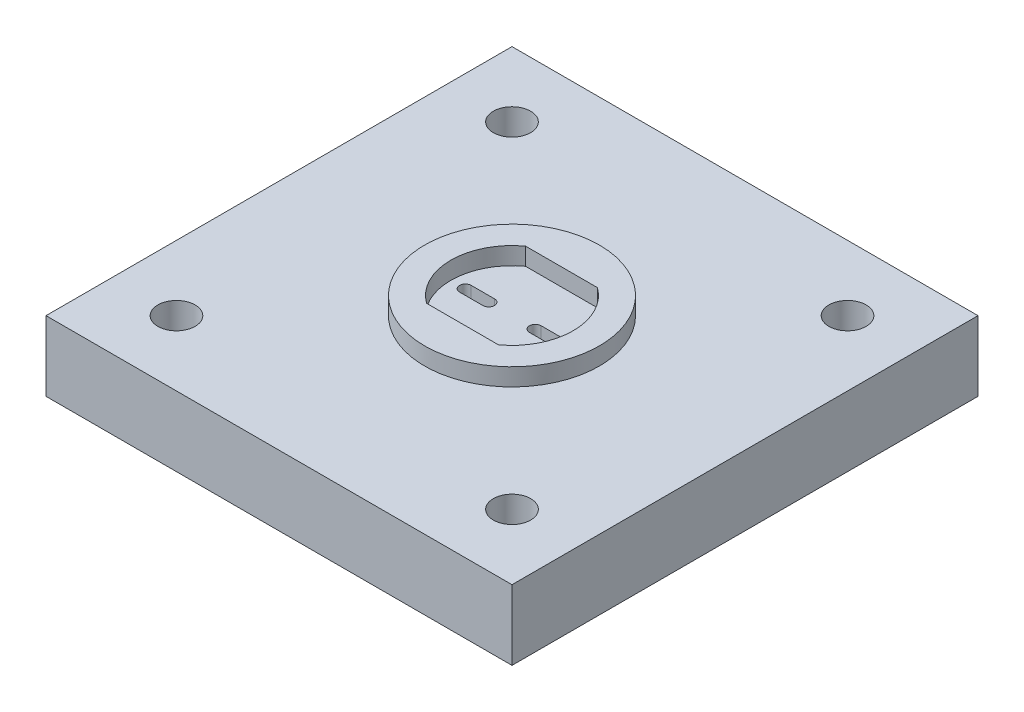
ISO-10303-21;
HEADER;
FILE_DESCRIPTION(('STEP AP214'),'2;1');
FILE_NAME('part.step','',(''),(''),'','','');
FILE_SCHEMA(('AUTOMOTIVE_DESIGN { 1 0 10303 214 1 1 1 1 }'));
ENDSEC;
DATA;
#1=APPLICATION_CONTEXT('core data for automotive mechanical design processes');
#2=APPLICATION_PROTOCOL_DEFINITION('international standard','automotive_design',2000,#1);
#3=PRODUCT_CONTEXT('',#1,'mechanical');
#4=PRODUCT('Part','Part','',(#3));
#5=PRODUCT_RELATED_PRODUCT_CATEGORY('part','',(#4));
#6=PRODUCT_DEFINITION_FORMATION('','',#4);
#7=PRODUCT_DEFINITION_CONTEXT('part definition',#1,'design');
#8=PRODUCT_DEFINITION('design','',#6,#7);
#9=PRODUCT_DEFINITION_SHAPE('','',#8);
#10=(LENGTH_UNIT() NAMED_UNIT(*) SI_UNIT(.MILLI.,.METRE.));
#11=(NAMED_UNIT(*) PLANE_ANGLE_UNIT() SI_UNIT($,.RADIAN.));
#12=(NAMED_UNIT(*) SI_UNIT($,.STERADIAN.) SOLID_ANGLE_UNIT());
#13=UNCERTAINTY_MEASURE_WITH_UNIT(LENGTH_MEASURE(1.E-05),#10,'distance_accuracy_value','');
#14=(GEOMETRIC_REPRESENTATION_CONTEXT(3) GLOBAL_UNCERTAINTY_ASSIGNED_CONTEXT((#13)) GLOBAL_UNIT_ASSIGNED_CONTEXT((#10,
#11,#12)) REPRESENTATION_CONTEXT('',''));
#15=CARTESIAN_POINT('',(0.,0.,0.));
#16=DIRECTION('',(0.,0.,1.));
#17=DIRECTION('',(1.,0.,0.));
#18=AXIS2_PLACEMENT_3D('',#15,#16,#17);
#19=CARTESIAN_POINT('',(0.,6.,0.));
#20=DIRECTION('',(0.,-1.,0.));
#21=DIRECTION('',(0.,0.,-1.));
#22=AXIS2_PLACEMENT_3D('',#19,#20,#21);
#23=PLANE('',#22);
#24=CARTESIAN_POINT('',(20.,6.,-20.));
#25=DIRECTION('',(0.,-1.,0.));
#26=DIRECTION('',(0.,0.,-1.));
#27=AXIS2_PLACEMENT_3D('',#24,#25,#26);
#28=CIRCLE('',#27,7.5);
#29=CARTESIAN_POINT('',(20.,6.,-27.5));
#30=VERTEX_POINT('',#29);
#31=EDGE_CURVE('E11',#30,#30,#28,.F.);
#32=ORIENTED_EDGE('',*,*,#31,.F.);
#33=EDGE_LOOP('',(#32));
#34=FACE_BOUND('',#33,.T.);
#35=DIRECTION('',(0.,0.,1.));
#36=VECTOR('',#35,1.);
#37=CARTESIAN_POINT('',(0.,6.,0.));
#38=LINE('',#37,#36);
#39=CARTESIAN_POINT('',(0.,6.,-40.));
#40=VERTEX_POINT('',#39);
#41=CARTESIAN_POINT('',(0.,6.,0.));
#42=VERTEX_POINT('',#41);
#43=EDGE_CURVE('E324',#40,#42,#38,.T.);
#44=ORIENTED_EDGE('',*,*,#43,.T.);
#45=DIRECTION('',(1.,0.,0.));
#46=VECTOR('',#45,1.);
#47=CARTESIAN_POINT('',(0.,6.,0.));
#48=LINE('',#47,#46);
#49=CARTESIAN_POINT('',(40.,6.,0.));
#50=VERTEX_POINT('',#49);
#51=EDGE_CURVE('E328',#42,#50,#48,.T.);
#52=ORIENTED_EDGE('',*,*,#51,.T.);
#53=DIRECTION('',(0.,0.,-1.));
#54=VECTOR('',#53,1.);
#55=CARTESIAN_POINT('',(40.,6.,0.));
#56=LINE('',#55,#54);
#57=CARTESIAN_POINT('',(40.,6.,-40.));
#58=VERTEX_POINT('',#57);
#59=EDGE_CURVE('E332',#50,#58,#56,.T.);
#60=ORIENTED_EDGE('',*,*,#59,.T.);
#61=DIRECTION('',(-1.,0.,0.));
#62=VECTOR('',#61,1.);
#63=CARTESIAN_POINT('',(0.,6.,-40.));
#64=LINE('',#63,#62);
#65=EDGE_CURVE('E335',#58,#40,#64,.T.);
#66=ORIENTED_EDGE('',*,*,#65,.T.);
#67=EDGE_LOOP('',(#44,#52,#60,#66));
#68=FACE_BOUND('',#67,.T.);
#69=CARTESIAN_POINT('',(5.6,6.,-34.4));
#70=DIRECTION('',(0.,1.,0.));
#71=DIRECTION('',(0.,0.,1.));
#72=AXIS2_PLACEMENT_3D('',#69,#70,#71);
#73=CIRCLE('',#72,1.6);
#74=CARTESIAN_POINT('',(5.6,6.,-32.8));
#75=VERTEX_POINT('',#74);
#76=EDGE_CURVE('E316',#75,#75,#73,.T.);
#77=ORIENTED_EDGE('',*,*,#76,.F.);
#78=EDGE_LOOP('',(#77));
#79=FACE_BOUND('',#78,.T.);
#80=CARTESIAN_POINT('',(5.6,6.,-5.6));
#81=DIRECTION('',(0.,1.,0.));
#82=DIRECTION('',(0.,0.,1.));
#83=AXIS2_PLACEMENT_3D('',#80,#81,#82);
#84=CIRCLE('',#83,1.6);
#85=CARTESIAN_POINT('',(5.6,6.,-4.));
#86=VERTEX_POINT('',#85);
#87=EDGE_CURVE('E308',#86,#86,#84,.T.);
#88=ORIENTED_EDGE('',*,*,#87,.F.);
#89=EDGE_LOOP('',(#88));
#90=FACE_BOUND('',#89,.T.);
#91=CARTESIAN_POINT('',(34.4,6.,-34.4));
#92=DIRECTION('',(0.,1.,0.));
#93=DIRECTION('',(0.,0.,1.));
#94=AXIS2_PLACEMENT_3D('',#91,#92,#93);
#95=CIRCLE('',#94,1.6);
#96=CARTESIAN_POINT('',(34.4,6.,-32.8));
#97=VERTEX_POINT('',#96);
#98=EDGE_CURVE('E300',#97,#97,#95,.T.);
#99=ORIENTED_EDGE('',*,*,#98,.F.);
#100=EDGE_LOOP('',(#99));
#101=FACE_BOUND('',#100,.T.);
#102=CARTESIAN_POINT('',(34.4,6.,-5.6));
#103=DIRECTION('',(0.,1.,0.));
#104=DIRECTION('',(0.,0.,1.));
#105=AXIS2_PLACEMENT_3D('',#102,#103,#104);
#106=CIRCLE('',#105,1.6);
#107=CARTESIAN_POINT('',(34.4,6.,-4.));
#108=VERTEX_POINT('',#107);
#109=EDGE_CURVE('E292',#108,#108,#106,.T.);
#110=ORIENTED_EDGE('',*,*,#109,.F.);
#111=EDGE_LOOP('',(#110));
#112=FACE_BOUND('',#111,.T.);
#113=ADVANCED_FACE('F47',(#34,#68,#79,#90,#101,#112),#23,.F.);
#114=CARTESIAN_POINT('',(0.,0.,0.));
#115=DIRECTION('',(0.,-1.,0.));
#116=DIRECTION('',(0.,0.,-1.));
#117=AXIS2_PLACEMENT_3D('',#114,#115,#116);
#118=PLANE('',#117);
#119=CARTESIAN_POINT('',(16.,0.,-20.));
#120=DIRECTION('',(0.,-1.,0.));
#121=DIRECTION('',(0.,0.,-1.));
#122=AXIS2_PLACEMENT_3D('',#119,#120,#121);
#123=CIRCLE('',#122,0.5);
#124=CARTESIAN_POINT('',(16.,0.,-19.5));
#125=VERTEX_POINT('',#124);
#126=CARTESIAN_POINT('',(16.,0.,-20.5));
#127=VERTEX_POINT('',#126);
#128=EDGE_CURVE('E245',#125,#127,#123,.T.);
#129=ORIENTED_EDGE('',*,*,#128,.F.);
#130=DIRECTION('',(-1.,0.,0.));
#131=VECTOR('',#130,1.);
#132=CARTESIAN_POINT('',(0.,0.,-19.5));
#133=LINE('',#132,#131);
#134=CARTESIAN_POINT('',(18.,0.,-19.5));
#135=VERTEX_POINT('',#134);
#136=EDGE_CURVE('E237',#135,#125,#133,.T.);
#137=ORIENTED_EDGE('',*,*,#136,.F.);
#138=CARTESIAN_POINT('',(18.,0.,-20.));
#139=DIRECTION('',(0.,-1.,0.));
#140=DIRECTION('',(0.,0.,-1.));
#141=AXIS2_PLACEMENT_3D('',#138,#139,#140);
#142=CIRCLE('',#141,0.5);
#143=CARTESIAN_POINT('',(18.,0.,-20.5));
#144=VERTEX_POINT('',#143);
#145=EDGE_CURVE('E166',#144,#135,#142,.T.);
#146=ORIENTED_EDGE('',*,*,#145,.F.);
#147=DIRECTION('',(1.,0.,0.));
#148=VECTOR('',#147,1.);
#149=CARTESIAN_POINT('',(0.,0.,-20.5));
#150=LINE('',#149,#148);
#151=EDGE_CURVE('E242',#127,#144,#150,.T.);
#152=ORIENTED_EDGE('',*,*,#151,.F.);
#153=EDGE_LOOP('',(#129,#137,#146,#152));
#154=FACE_BOUND('',#153,.T.);
#155=CARTESIAN_POINT('',(24.,0.,-20.));
#156=DIRECTION('',(0.,-1.,0.));
#157=DIRECTION('',(0.,0.,-1.));
#158=AXIS2_PLACEMENT_3D('',#155,#156,#157);
#159=CIRCLE('',#158,0.500000000000002);
#160=CARTESIAN_POINT('',(24.,0.,-20.5));
#161=VERTEX_POINT('',#160);
#162=CARTESIAN_POINT('',(24.,0.,-19.5));
#163=VERTEX_POINT('',#162);
#164=EDGE_CURVE('E234',#161,#163,#159,.T.);
#165=ORIENTED_EDGE('',*,*,#164,.F.);
#166=DIRECTION('',(1.,0.,0.));
#167=VECTOR('',#166,1.);
#168=CARTESIAN_POINT('',(0.,0.,-20.5));
#169=LINE('',#168,#167);
#170=CARTESIAN_POINT('',(22.,0.,-20.5));
#171=VERTEX_POINT('',#170);
#172=EDGE_CURVE('E195',#171,#161,#169,.T.);
#173=ORIENTED_EDGE('',*,*,#172,.F.);
#174=CARTESIAN_POINT('',(22.,0.,-20.));
#175=DIRECTION('',(0.,-1.,0.));
#176=DIRECTION('',(0.,0.,-1.));
#177=AXIS2_PLACEMENT_3D('',#174,#175,#176);
#178=CIRCLE('',#177,0.5);
#179=CARTESIAN_POINT('',(22.,0.,-19.5));
#180=VERTEX_POINT('',#179);
#181=EDGE_CURVE('E228',#180,#171,#178,.T.);
#182=ORIENTED_EDGE('',*,*,#181,.F.);
#183=DIRECTION('',(-1.,0.,0.));
#184=VECTOR('',#183,1.);
#185=CARTESIAN_POINT('',(0.,0.,-19.5));
#186=LINE('',#185,#184);
#187=EDGE_CURVE('E231',#163,#180,#186,.T.);
#188=ORIENTED_EDGE('',*,*,#187,.F.);
#189=EDGE_LOOP('',(#165,#173,#182,#188));
#190=FACE_BOUND('',#189,.T.);
#191=CARTESIAN_POINT('',(34.4,0.,-34.4));
#192=DIRECTION('',(0.,1.,0.));
#193=DIRECTION('',(0.,0.,1.));
#194=AXIS2_PLACEMENT_3D('',#191,#192,#193);
#195=CIRCLE('',#194,1.6);
#196=CARTESIAN_POINT('',(34.4,0.,-32.8));
#197=VERTEX_POINT('',#196);
#198=EDGE_CURVE('E296',#197,#197,#195,.T.);
#199=ORIENTED_EDGE('',*,*,#198,.T.);
#200=EDGE_LOOP('',(#199));
#201=FACE_BOUND('',#200,.T.);
#202=CARTESIAN_POINT('',(5.6,0.,-34.4));
#203=DIRECTION('',(0.,1.,0.));
#204=DIRECTION('',(0.,0.,1.));
#205=AXIS2_PLACEMENT_3D('',#202,#203,#204);
#206=CIRCLE('',#205,1.6);
#207=CARTESIAN_POINT('',(5.6,0.,-32.8));
#208=VERTEX_POINT('',#207);
#209=EDGE_CURVE('E312',#208,#208,#206,.T.);
#210=ORIENTED_EDGE('',*,*,#209,.T.);
#211=EDGE_LOOP('',(#210));
#212=FACE_BOUND('',#211,.T.);
#213=DIRECTION('',(0.,0.,1.));
#214=VECTOR('',#213,1.);
#215=CARTESIAN_POINT('',(0.,0.,0.));
#216=LINE('',#215,#214);
#217=CARTESIAN_POINT('',(0.,0.,-40.));
#218=VERTEX_POINT('',#217);
#219=CARTESIAN_POINT('',(0.,0.,0.));
#220=VERTEX_POINT('',#219);
#221=EDGE_CURVE('E320',#218,#220,#216,.T.);
#222=ORIENTED_EDGE('',*,*,#221,.F.);
#223=DIRECTION('',(-1.,0.,0.));
#224=VECTOR('',#223,1.);
#225=CARTESIAN_POINT('',(0.,0.,-40.));
#226=LINE('',#225,#224);
#227=CARTESIAN_POINT('',(40.,0.,-40.));
#228=VERTEX_POINT('',#227);
#229=EDGE_CURVE('E329',#228,#218,#226,.T.);
#230=ORIENTED_EDGE('',*,*,#229,.F.);
#231=DIRECTION('',(0.,0.,-1.));
#232=VECTOR('',#231,1.);
#233=CARTESIAN_POINT('',(40.,0.,0.));
#234=LINE('',#233,#232);
#235=CARTESIAN_POINT('',(40.,0.,0.));
#236=VERTEX_POINT('',#235);
#237=EDGE_CURVE('E345',#236,#228,#234,.T.);
#238=ORIENTED_EDGE('',*,*,#237,.F.);
#239=DIRECTION('',(1.,0.,0.));
#240=VECTOR('',#239,1.);
#241=CARTESIAN_POINT('',(0.,0.,0.));
#242=LINE('',#241,#240);
#243=EDGE_CURVE('E342',#220,#236,#242,.T.);
#244=ORIENTED_EDGE('',*,*,#243,.F.);
#245=EDGE_LOOP('',(#222,#230,#238,#244));
#246=FACE_BOUND('',#245,.T.);
#247=CARTESIAN_POINT('',(5.6,0.,-5.6));
#248=DIRECTION('',(0.,1.,0.));
#249=DIRECTION('',(0.,0.,1.));
#250=AXIS2_PLACEMENT_3D('',#247,#248,#249);
#251=CIRCLE('',#250,1.6);
#252=CARTESIAN_POINT('',(5.6,0.,-4.));
#253=VERTEX_POINT('',#252);
#254=EDGE_CURVE('E304',#253,#253,#251,.T.);
#255=ORIENTED_EDGE('',*,*,#254,.T.);
#256=EDGE_LOOP('',(#255));
#257=FACE_BOUND('',#256,.T.);
#258=CARTESIAN_POINT('',(34.4,0.,-5.6));
#259=DIRECTION('',(0.,1.,0.));
#260=DIRECTION('',(0.,0.,1.));
#261=AXIS2_PLACEMENT_3D('',#258,#259,#260);
#262=CIRCLE('',#261,1.6);
#263=CARTESIAN_POINT('',(34.4,0.,-4.));
#264=VERTEX_POINT('',#263);
#265=EDGE_CURVE('E291',#264,#264,#262,.T.);
#266=ORIENTED_EDGE('',*,*,#265,.T.);
#267=EDGE_LOOP('',(#266));
#268=FACE_BOUND('',#267,.T.);
#269=ADVANCED_FACE('F372',(#154,#190,#201,#212,#246,#257,#268),#118,.T.);
#270=CARTESIAN_POINT('',(0.,6.,0.));
#271=DIRECTION('',(1.,0.,0.));
#272=DIRECTION('',(0.,0.,-1.));
#273=AXIS2_PLACEMENT_3D('',#270,#271,#272);
#274=PLANE('',#273);
#275=ORIENTED_EDGE('',*,*,#221,.T.);
#276=DIRECTION('',(0.,-1.,0.));
#277=VECTOR('',#276,1.);
#278=CARTESIAN_POINT('',(0.,6.,0.));
#279=LINE('',#278,#277);
#280=EDGE_CURVE('E56',#42,#220,#279,.T.);
#281=ORIENTED_EDGE('',*,*,#280,.F.);
#282=ORIENTED_EDGE('',*,*,#43,.F.);
#283=DIRECTION('',(0.,-1.,0.));
#284=VECTOR('',#283,1.);
#285=CARTESIAN_POINT('',(0.,6.,-40.));
#286=LINE('',#285,#284);
#287=EDGE_CURVE('E338',#40,#218,#286,.T.);
#288=ORIENTED_EDGE('',*,*,#287,.T.);
#289=EDGE_LOOP('',(#275,#281,#282,#288));
#290=FACE_BOUND('',#289,.T.);
#291=ADVANCED_FACE('F49',(#290),#274,.F.);
#292=CARTESIAN_POINT('',(0.,6.,0.));
#293=DIRECTION('',(0.,0.,-1.));
#294=DIRECTION('',(-1.,0.,0.));
#295=AXIS2_PLACEMENT_3D('',#292,#293,#294);
#296=PLANE('',#295);
#297=ORIENTED_EDGE('',*,*,#243,.T.);
#298=DIRECTION('',(0.,-1.,0.));
#299=VECTOR('',#298,1.);
#300=CARTESIAN_POINT('',(40.,6.,0.));
#301=LINE('',#300,#299);
#302=EDGE_CURVE('E357',#50,#236,#301,.T.);
#303=ORIENTED_EDGE('',*,*,#302,.F.);
#304=ORIENTED_EDGE('',*,*,#51,.F.);
#305=ORIENTED_EDGE('',*,*,#280,.T.);
#306=EDGE_LOOP('',(#297,#303,#304,#305));
#307=FACE_BOUND('',#306,.T.);
#308=ADVANCED_FACE('F364',(#307),#296,.F.);
#309=CARTESIAN_POINT('',(40.,6.,0.));
#310=DIRECTION('',(-1.,0.,0.));
#311=DIRECTION('',(0.,0.,1.));
#312=AXIS2_PLACEMENT_3D('',#309,#310,#311);
#313=PLANE('',#312);
#314=ORIENTED_EDGE('',*,*,#237,.T.);
#315=DIRECTION('',(0.,-1.,0.));
#316=VECTOR('',#315,1.);
#317=CARTESIAN_POINT('',(40.,6.,-40.));
#318=LINE('',#317,#316);
#319=EDGE_CURVE('E353',#58,#228,#318,.T.);
#320=ORIENTED_EDGE('',*,*,#319,.F.);
#321=ORIENTED_EDGE('',*,*,#59,.F.);
#322=ORIENTED_EDGE('',*,*,#302,.T.);
#323=EDGE_LOOP('',(#314,#320,#321,#322));
#324=FACE_BOUND('',#323,.T.);
#325=ADVANCED_FACE('F377',(#324),#313,.F.);
#326=CARTESIAN_POINT('',(0.,6.,-40.));
#327=DIRECTION('',(0.,0.,1.));
#328=DIRECTION('',(1.,0.,0.));
#329=AXIS2_PLACEMENT_3D('',#326,#327,#328);
#330=PLANE('',#329);
#331=ORIENTED_EDGE('',*,*,#229,.T.);
#332=ORIENTED_EDGE('',*,*,#287,.F.);
#333=ORIENTED_EDGE('',*,*,#65,.F.);
#334=ORIENTED_EDGE('',*,*,#319,.T.);
#335=EDGE_LOOP('',(#331,#332,#333,#334));
#336=FACE_BOUND('',#335,.T.);
#337=ADVANCED_FACE('F381',(#336),#330,.F.);
#338=CARTESIAN_POINT('',(5.6,6.,-34.4));
#339=DIRECTION('',(0.,-1.,0.));
#340=DIRECTION('',(0.,0.,-1.));
#341=AXIS2_PLACEMENT_3D('',#338,#339,#340);
#342=CYLINDRICAL_SURFACE('',#341,1.6);
#343=ORIENTED_EDGE('',*,*,#76,.T.);
#344=EDGE_LOOP('',(#343));
#345=FACE_BOUND('',#344,.T.);
#346=ORIENTED_EDGE('',*,*,#209,.F.);
#347=EDGE_LOOP('',(#346));
#348=FACE_BOUND('',#347,.T.);
#349=ADVANCED_FACE('F417',(#345,#348),#342,.F.);
#350=CARTESIAN_POINT('',(5.6,6.,-5.6));
#351=DIRECTION('',(0.,-1.,0.));
#352=DIRECTION('',(0.,0.,-1.));
#353=AXIS2_PLACEMENT_3D('',#350,#351,#352);
#354=CYLINDRICAL_SURFACE('',#353,1.6);
#355=ORIENTED_EDGE('',*,*,#87,.T.);
#356=EDGE_LOOP('',(#355));
#357=FACE_BOUND('',#356,.T.);
#358=ORIENTED_EDGE('',*,*,#254,.F.);
#359=EDGE_LOOP('',(#358));
#360=FACE_BOUND('',#359,.T.);
#361=ADVANCED_FACE('F441',(#357,#360),#354,.F.);
#362=CARTESIAN_POINT('',(34.4,6.,-34.4));
#363=DIRECTION('',(0.,-1.,0.));
#364=DIRECTION('',(0.,0.,-1.));
#365=AXIS2_PLACEMENT_3D('',#362,#363,#364);
#366=CYLINDRICAL_SURFACE('',#365,1.6);
#367=ORIENTED_EDGE('',*,*,#98,.T.);
#368=EDGE_LOOP('',(#367));
#369=FACE_BOUND('',#368,.T.);
#370=ORIENTED_EDGE('',*,*,#198,.F.);
#371=EDGE_LOOP('',(#370));
#372=FACE_BOUND('',#371,.T.);
#373=ADVANCED_FACE('F399',(#369,#372),#366,.F.);
#374=CARTESIAN_POINT('',(34.4,6.,-5.6));
#375=DIRECTION('',(0.,-1.,0.));
#376=DIRECTION('',(0.,0.,-1.));
#377=AXIS2_PLACEMENT_3D('',#374,#375,#376);
#378=CYLINDRICAL_SURFACE('',#377,1.6);
#379=ORIENTED_EDGE('',*,*,#109,.T.);
#380=EDGE_LOOP('',(#379));
#381=FACE_BOUND('',#380,.T.);
#382=ORIENTED_EDGE('',*,*,#265,.F.);
#383=EDGE_LOOP('',(#382));
#384=FACE_BOUND('',#383,.T.);
#385=ADVANCED_FACE('F395',(#381,#384),#378,.F.);
#386=CARTESIAN_POINT('',(20.,7.5,-20.));
#387=DIRECTION('',(0.,-1.,0.));
#388=DIRECTION('',(0.,0.,-1.));
#389=AXIS2_PLACEMENT_3D('',#386,#387,#388);
#390=CYLINDRICAL_SURFACE('',#389,5.25);
#391=CARTESIAN_POINT('',(20.,6.,-20.));
#392=DIRECTION('',(0.,1.,0.));
#393=DIRECTION('',(0.,0.,1.));
#394=AXIS2_PLACEMENT_3D('',#391,#392,#393);
#395=CIRCLE('',#394,5.25);
#396=CARTESIAN_POINT('',(23.0822070014845,6.,-15.75));
#397=VERTEX_POINT('',#396);
#398=CARTESIAN_POINT('',(23.0822070014845,6.,-24.25));
#399=VERTEX_POINT('',#398);
#400=EDGE_CURVE('E248',#397,#399,#395,.T.);
#401=ORIENTED_EDGE('',*,*,#400,.F.);
#402=DIRECTION('',(0.,-1.,0.));
#403=VECTOR('',#402,1.);
#404=CARTESIAN_POINT('',(23.0822070014845,7.5,-15.75));
#405=LINE('',#404,#403);
#406=CARTESIAN_POINT('',(23.0822070014845,7.5,-15.75));
#407=VERTEX_POINT('',#406);
#408=EDGE_CURVE('E287',#407,#397,#405,.T.);
#409=ORIENTED_EDGE('',*,*,#408,.F.);
#410=CARTESIAN_POINT('',(20.,7.5,-20.));
#411=DIRECTION('',(0.,1.,0.));
#412=DIRECTION('',(0.,0.,1.));
#413=AXIS2_PLACEMENT_3D('',#410,#411,#412);
#414=CIRCLE('',#413,5.25);
#415=CARTESIAN_POINT('',(23.0822070014845,7.5,-24.25));
#416=VERTEX_POINT('',#415);
#417=EDGE_CURVE('E249',#407,#416,#414,.T.);
#418=ORIENTED_EDGE('',*,*,#417,.T.);
#419=DIRECTION('',(0.,-1.,0.));
#420=VECTOR('',#419,1.);
#421=CARTESIAN_POINT('',(23.0822070014845,7.5,-24.25));
#422=LINE('',#421,#420);
#423=EDGE_CURVE('E266',#416,#399,#422,.T.);
#424=ORIENTED_EDGE('',*,*,#423,.T.);
#425=EDGE_LOOP('',(#401,#409,#418,#424));
#426=FACE_BOUND('',#425,.T.);
#427=ADVANCED_FACE('F398',(#426),#390,.F.);
#428=CARTESIAN_POINT('',(0.,7.5,-15.75));
#429=DIRECTION('',(0.,0.,-1.));
#430=DIRECTION('',(-1.,0.,0.));
#431=AXIS2_PLACEMENT_3D('',#428,#429,#430);
#432=PLANE('',#431);
#433=DIRECTION('',(1.,0.,0.));
#434=VECTOR('',#433,1.);
#435=CARTESIAN_POINT('',(0.,6.,-15.75));
#436=LINE('',#435,#434);
#437=CARTESIAN_POINT('',(16.9177929985155,6.,-15.75));
#438=VERTEX_POINT('',#437);
#439=EDGE_CURVE('E269',#438,#397,#436,.T.);
#440=ORIENTED_EDGE('',*,*,#439,.F.);
#441=DIRECTION('',(0.,-1.,0.));
#442=VECTOR('',#441,1.);
#443=CARTESIAN_POINT('',(16.9177929985155,7.5,-15.75));
#444=LINE('',#443,#442);
#445=CARTESIAN_POINT('',(16.9177929985155,7.5,-15.75));
#446=VERTEX_POINT('',#445);
#447=EDGE_CURVE('E283',#446,#438,#444,.T.);
#448=ORIENTED_EDGE('',*,*,#447,.F.);
#449=DIRECTION('',(1.,0.,0.));
#450=VECTOR('',#449,1.);
#451=CARTESIAN_POINT('',(0.,7.5,-15.75));
#452=LINE('',#451,#450);
#453=EDGE_CURVE('E253',#446,#407,#452,.T.);
#454=ORIENTED_EDGE('',*,*,#453,.T.);
#455=ORIENTED_EDGE('',*,*,#408,.T.);
#456=EDGE_LOOP('',(#440,#448,#454,#455));
#457=FACE_BOUND('',#456,.T.);
#458=ADVANCED_FACE('F476',(#457),#432,.T.);
#459=CARTESIAN_POINT('',(16.9177929985155,6.,-24.25));
#460=VERTEX_POINT('',#459);
#461=EDGE_CURVE('E270',#460,#438,#395,.T.);
#462=ORIENTED_EDGE('',*,*,#461,.F.);
#463=DIRECTION('',(0.,-1.,0.));
#464=VECTOR('',#463,1.);
#465=CARTESIAN_POINT('',(16.9177929985155,7.5,-24.25));
#466=LINE('',#465,#464);
#467=CARTESIAN_POINT('',(16.9177929985155,7.5,-24.25));
#468=VERTEX_POINT('',#467);
#469=EDGE_CURVE('E279',#468,#460,#466,.T.);
#470=ORIENTED_EDGE('',*,*,#469,.F.);
#471=EDGE_CURVE('E255',#468,#446,#414,.T.);
#472=ORIENTED_EDGE('',*,*,#471,.T.);
#473=ORIENTED_EDGE('',*,*,#447,.T.);
#474=EDGE_LOOP('',(#462,#470,#472,#473));
#475=FACE_BOUND('',#474,.T.);
#476=ADVANCED_FACE('F479',(#475),#390,.F.);
#477=CARTESIAN_POINT('',(0.,7.5,-24.25));
#478=DIRECTION('',(0.,0.,-1.));
#479=DIRECTION('',(-1.,0.,0.));
#480=AXIS2_PLACEMENT_3D('',#477,#478,#479);
#481=PLANE('',#480);
#482=DIRECTION('',(1.,0.,0.));
#483=VECTOR('',#482,1.);
#484=CARTESIAN_POINT('',(0.,6.,-24.25));
#485=LINE('',#484,#483);
#486=EDGE_CURVE('E254',#460,#399,#485,.T.);
#487=ORIENTED_EDGE('',*,*,#486,.T.);
#488=ORIENTED_EDGE('',*,*,#423,.F.);
#489=DIRECTION('',(1.,0.,0.));
#490=VECTOR('',#489,1.);
#491=CARTESIAN_POINT('',(0.,7.5,-24.25));
#492=LINE('',#491,#490);
#493=EDGE_CURVE('E259',#468,#416,#492,.T.);
#494=ORIENTED_EDGE('',*,*,#493,.F.);
#495=ORIENTED_EDGE('',*,*,#469,.T.);
#496=EDGE_LOOP('',(#487,#488,#494,#495));
#497=FACE_BOUND('',#496,.T.);
#498=ADVANCED_FACE('F494',(#497),#481,.F.);
#499=CARTESIAN_POINT('',(20.,7.5,-20.));
#500=DIRECTION('',(0.,-1.,0.));
#501=DIRECTION('',(0.,0.,-1.));
#502=AXIS2_PLACEMENT_3D('',#499,#500,#501);
#503=CYLINDRICAL_SURFACE('',#502,7.5);
#504=CARTESIAN_POINT('',(20.,7.5,-20.));
#505=DIRECTION('',(0.,1.,0.));
#506=DIRECTION('',(0.,0.,1.));
#507=AXIS2_PLACEMENT_3D('',#504,#505,#506);
#508=CIRCLE('',#507,7.5);
#509=CARTESIAN_POINT('',(20.,7.5,-12.5));
#510=VERTEX_POINT('',#509);
#511=EDGE_CURVE('E262',#510,#510,#508,.T.);
#512=ORIENTED_EDGE('',*,*,#511,.F.);
#513=EDGE_LOOP('',(#512));
#514=FACE_BOUND('',#513,.T.);
#515=ORIENTED_EDGE('',*,*,#31,.T.);
#516=EDGE_LOOP('',(#515));
#517=FACE_BOUND('',#516,.T.);
#518=ADVANCED_FACE('F502',(#514,#517),#503,.T.);
#519=CARTESIAN_POINT('',(0.,7.5,0.));
#520=DIRECTION('',(0.,1.,0.));
#521=DIRECTION('',(0.,0.,1.));
#522=AXIS2_PLACEMENT_3D('',#519,#520,#521);
#523=PLANE('',#522);
#524=ORIENTED_EDGE('',*,*,#417,.F.);
#525=ORIENTED_EDGE('',*,*,#453,.F.);
#526=ORIENTED_EDGE('',*,*,#471,.F.);
#527=ORIENTED_EDGE('',*,*,#493,.T.);
#528=EDGE_LOOP('',(#524,#525,#526,#527));
#529=FACE_BOUND('',#528,.T.);
#530=ORIENTED_EDGE('',*,*,#511,.T.);
#531=EDGE_LOOP('',(#530));
#532=FACE_BOUND('',#531,.T.);
#533=ADVANCED_FACE('F510',(#529,#532),#523,.T.);
#534=DIRECTION('',(1.,0.,0.));
#535=VECTOR('',#534,1.);
#536=CARTESIAN_POINT('',(16.,6.,-19.5));
#537=LINE('',#536,#535);
#538=CARTESIAN_POINT('',(16.,6.,-19.5));
#539=VERTEX_POINT('',#538);
#540=CARTESIAN_POINT('',(18.,6.,-19.5));
#541=VERTEX_POINT('',#540);
#542=EDGE_CURVE('E174',#539,#541,#537,.T.);
#543=ORIENTED_EDGE('',*,*,#542,.F.);
#544=CARTESIAN_POINT('',(16.,6.,-20.));
#545=DIRECTION('',(0.,1.,0.));
#546=DIRECTION('',(0.,0.,1.));
#547=AXIS2_PLACEMENT_3D('',#544,#545,#546);
#548=CIRCLE('',#547,0.5);
#549=CARTESIAN_POINT('',(16.,6.,-20.5));
#550=VERTEX_POINT('',#549);
#551=EDGE_CURVE('E180',#550,#539,#548,.T.);
#552=ORIENTED_EDGE('',*,*,#551,.F.);
#553=DIRECTION('',(-1.,0.,0.));
#554=VECTOR('',#553,1.);
#555=CARTESIAN_POINT('',(16.,6.,-20.5));
#556=LINE('',#555,#554);
#557=CARTESIAN_POINT('',(18.,6.,-20.5));
#558=VERTEX_POINT('',#557);
#559=EDGE_CURVE('E185',#558,#550,#556,.T.);
#560=ORIENTED_EDGE('',*,*,#559,.F.);
#561=CARTESIAN_POINT('',(18.,6.,-20.));
#562=DIRECTION('',(0.,1.,0.));
#563=DIRECTION('',(0.,0.,1.));
#564=AXIS2_PLACEMENT_3D('',#561,#562,#563);
#565=CIRCLE('',#564,0.5);
#566=EDGE_CURVE('E163',#541,#558,#565,.T.);
#567=ORIENTED_EDGE('',*,*,#566,.F.);
#568=EDGE_LOOP('',(#543,#552,#560,#567));
#569=FACE_BOUND('',#568,.T.);
#570=DIRECTION('',(-1.,0.,0.));
#571=VECTOR('',#570,1.);
#572=CARTESIAN_POINT('',(24.,6.,-20.5));
#573=LINE('',#572,#571);
#574=CARTESIAN_POINT('',(24.,6.,-20.5));
#575=VERTEX_POINT('',#574);
#576=CARTESIAN_POINT('',(22.,6.,-20.5));
#577=VERTEX_POINT('',#576);
#578=EDGE_CURVE('E220',#575,#577,#573,.T.);
#579=ORIENTED_EDGE('',*,*,#578,.F.);
#580=CARTESIAN_POINT('',(24.,6.,-20.));
#581=DIRECTION('',(0.,1.,0.));
#582=DIRECTION('',(0.,0.,1.));
#583=AXIS2_PLACEMENT_3D('',#580,#581,#582);
#584=CIRCLE('',#583,0.500000000000002);
#585=CARTESIAN_POINT('',(24.,6.,-19.5));
#586=VERTEX_POINT('',#585);
#587=EDGE_CURVE('E223',#586,#575,#584,.T.);
#588=ORIENTED_EDGE('',*,*,#587,.F.);
#589=DIRECTION('',(1.,0.,0.));
#590=VECTOR('',#589,1.);
#591=CARTESIAN_POINT('',(24.,6.,-19.5));
#592=LINE('',#591,#590);
#593=CARTESIAN_POINT('',(22.,6.,-19.5));
#594=VERTEX_POINT('',#593);
#595=EDGE_CURVE('E204',#594,#586,#592,.T.);
#596=ORIENTED_EDGE('',*,*,#595,.F.);
#597=CARTESIAN_POINT('',(22.,6.,-20.));
#598=DIRECTION('',(0.,1.,0.));
#599=DIRECTION('',(0.,0.,1.));
#600=AXIS2_PLACEMENT_3D('',#597,#598,#599);
#601=CIRCLE('',#600,0.5);
#602=EDGE_CURVE('E216',#577,#594,#601,.T.);
#603=ORIENTED_EDGE('',*,*,#602,.F.);
#604=EDGE_LOOP('',(#579,#588,#596,#603));
#605=FACE_BOUND('',#604,.T.);
#606=ORIENTED_EDGE('',*,*,#439,.T.);
#607=ORIENTED_EDGE('',*,*,#400,.T.);
#608=ORIENTED_EDGE('',*,*,#486,.F.);
#609=ORIENTED_EDGE('',*,*,#461,.T.);
#610=EDGE_LOOP('',(#606,#607,#608,#609));
#611=FACE_BOUND('',#610,.T.);
#612=ADVANCED_FACE('F182',(#569,#605,#611),#23,.F.);
#613=CARTESIAN_POINT('',(24.,-15.5,-20.));
#614=DIRECTION('',(0.,1.,0.));
#615=DIRECTION('',(0.,0.,1.));
#616=AXIS2_PLACEMENT_3D('',#613,#614,#615);
#617=CYLINDRICAL_SURFACE('',#616,0.500000000000002);
#618=ORIENTED_EDGE('',*,*,#164,.T.);
#619=DIRECTION('',(0.,1.,0.));
#620=VECTOR('',#619,1.);
#621=CARTESIAN_POINT('',(24.,-15.5,-19.5));
#622=LINE('',#621,#620);
#623=EDGE_CURVE('E210',#163,#586,#622,.T.);
#624=ORIENTED_EDGE('',*,*,#623,.T.);
#625=ORIENTED_EDGE('',*,*,#587,.T.);
#626=DIRECTION('',(0.,1.,0.));
#627=VECTOR('',#626,1.);
#628=CARTESIAN_POINT('',(24.,-15.5,-20.5));
#629=LINE('',#628,#627);
#630=EDGE_CURVE('E200',#161,#575,#629,.T.);
#631=ORIENTED_EDGE('',*,*,#630,.F.);
#632=EDGE_LOOP('',(#618,#624,#625,#631));
#633=FACE_BOUND('',#632,.T.);
#634=ADVANCED_FACE('F527',(#633),#617,.F.);
#635=CARTESIAN_POINT('',(24.,-15.5,-19.5));
#636=DIRECTION('',(0.,0.,1.));
#637=DIRECTION('',(1.,0.,0.));
#638=AXIS2_PLACEMENT_3D('',#635,#636,#637);
#639=PLANE('',#638);
#640=ORIENTED_EDGE('',*,*,#187,.T.);
#641=DIRECTION('',(0.,1.,0.));
#642=VECTOR('',#641,1.);
#643=CARTESIAN_POINT('',(22.,-15.5,-19.5));
#644=LINE('',#643,#642);
#645=EDGE_CURVE('E207',#180,#594,#644,.T.);
#646=ORIENTED_EDGE('',*,*,#645,.T.);
#647=ORIENTED_EDGE('',*,*,#595,.T.);
#648=ORIENTED_EDGE('',*,*,#623,.F.);
#649=EDGE_LOOP('',(#640,#646,#647,#648));
#650=FACE_BOUND('',#649,.T.);
#651=ADVANCED_FACE('F533',(#650),#639,.F.);
#652=CARTESIAN_POINT('',(22.,-15.5,-20.));
#653=DIRECTION('',(0.,1.,0.));
#654=DIRECTION('',(0.,0.,1.));
#655=AXIS2_PLACEMENT_3D('',#652,#653,#654);
#656=CYLINDRICAL_SURFACE('',#655,0.5);
#657=ORIENTED_EDGE('',*,*,#181,.T.);
#658=DIRECTION('',(0.,1.,0.));
#659=VECTOR('',#658,1.);
#660=CARTESIAN_POINT('',(22.,-15.5,-20.5));
#661=LINE('',#660,#659);
#662=EDGE_CURVE('E71',#171,#577,#661,.T.);
#663=ORIENTED_EDGE('',*,*,#662,.T.);
#664=ORIENTED_EDGE('',*,*,#602,.T.);
#665=ORIENTED_EDGE('',*,*,#645,.F.);
#666=EDGE_LOOP('',(#657,#663,#664,#665));
#667=FACE_BOUND('',#666,.T.);
#668=ADVANCED_FACE('F544',(#667),#656,.F.);
#669=CARTESIAN_POINT('',(24.,-15.5,-20.5));
#670=DIRECTION('',(0.,0.,-1.));
#671=DIRECTION('',(-1.,0.,0.));
#672=AXIS2_PLACEMENT_3D('',#669,#670,#671);
#673=PLANE('',#672);
#674=ORIENTED_EDGE('',*,*,#172,.T.);
#675=ORIENTED_EDGE('',*,*,#630,.T.);
#676=ORIENTED_EDGE('',*,*,#578,.T.);
#677=ORIENTED_EDGE('',*,*,#662,.F.);
#678=EDGE_LOOP('',(#674,#675,#676,#677));
#679=FACE_BOUND('',#678,.T.);
#680=ADVANCED_FACE('F554',(#679),#673,.F.);
#681=CARTESIAN_POINT('',(16.,-15.5,-20.));
#682=DIRECTION('',(0.,1.,0.));
#683=DIRECTION('',(0.,0.,1.));
#684=AXIS2_PLACEMENT_3D('',#681,#682,#683);
#685=CYLINDRICAL_SURFACE('',#684,0.5);
#686=ORIENTED_EDGE('',*,*,#128,.T.);
#687=DIRECTION('',(0.,1.,0.));
#688=VECTOR('',#687,1.);
#689=CARTESIAN_POINT('',(16.,-15.5,-20.5));
#690=LINE('',#689,#688);
#691=EDGE_CURVE('E192',#127,#550,#690,.T.);
#692=ORIENTED_EDGE('',*,*,#691,.T.);
#693=ORIENTED_EDGE('',*,*,#551,.T.);
#694=DIRECTION('',(0.,1.,0.));
#695=VECTOR('',#694,1.);
#696=CARTESIAN_POINT('',(16.,-15.5,-19.5));
#697=LINE('',#696,#695);
#698=EDGE_CURVE('E170',#125,#539,#697,.T.);
#699=ORIENTED_EDGE('',*,*,#698,.F.);
#700=EDGE_LOOP('',(#686,#692,#693,#699));
#701=FACE_BOUND('',#700,.T.);
#702=ADVANCED_FACE('F564',(#701),#685,.F.);
#703=CARTESIAN_POINT('',(16.,-15.5,-20.5));
#704=DIRECTION('',(0.,0.,-1.));
#705=DIRECTION('',(-1.,0.,0.));
#706=AXIS2_PLACEMENT_3D('',#703,#704,#705);
#707=PLANE('',#706);
#708=ORIENTED_EDGE('',*,*,#151,.T.);
#709=DIRECTION('',(0.,1.,0.));
#710=VECTOR('',#709,1.);
#711=CARTESIAN_POINT('',(18.,-15.5,-20.5));
#712=LINE('',#711,#710);
#713=EDGE_CURVE('E169',#144,#558,#712,.T.);
#714=ORIENTED_EDGE('',*,*,#713,.T.);
#715=ORIENTED_EDGE('',*,*,#559,.T.);
#716=ORIENTED_EDGE('',*,*,#691,.F.);
#717=EDGE_LOOP('',(#708,#714,#715,#716));
#718=FACE_BOUND('',#717,.T.);
#719=ADVANCED_FACE('F573',(#718),#707,.F.);
#720=CARTESIAN_POINT('',(18.,-15.5,-20.));
#721=DIRECTION('',(0.,1.,0.));
#722=DIRECTION('',(0.,0.,1.));
#723=AXIS2_PLACEMENT_3D('',#720,#721,#722);
#724=CYLINDRICAL_SURFACE('',#723,0.5);
#725=ORIENTED_EDGE('',*,*,#145,.T.);
#726=DIRECTION('',(0.,1.,0.));
#727=VECTOR('',#726,1.);
#728=CARTESIAN_POINT('',(18.,-15.5,-19.5));
#729=LINE('',#728,#727);
#730=EDGE_CURVE('E63',#135,#541,#729,.T.);
#731=ORIENTED_EDGE('',*,*,#730,.T.);
#732=ORIENTED_EDGE('',*,*,#566,.T.);
#733=ORIENTED_EDGE('',*,*,#713,.F.);
#734=EDGE_LOOP('',(#725,#731,#732,#733));
#735=FACE_BOUND('',#734,.T.);
#736=ADVANCED_FACE('F160',(#735),#724,.F.);
#737=CARTESIAN_POINT('',(16.,-15.5,-19.5));
#738=DIRECTION('',(0.,0.,1.));
#739=DIRECTION('',(1.,0.,0.));
#740=AXIS2_PLACEMENT_3D('',#737,#738,#739);
#741=PLANE('',#740);
#742=ORIENTED_EDGE('',*,*,#136,.T.);
#743=ORIENTED_EDGE('',*,*,#698,.T.);
#744=ORIENTED_EDGE('',*,*,#542,.T.);
#745=ORIENTED_EDGE('',*,*,#730,.F.);
#746=EDGE_LOOP('',(#742,#743,#744,#745));
#747=FACE_BOUND('',#746,.T.);
#748=ADVANCED_FACE('F175',(#747),#741,.F.);
#749=CLOSED_SHELL('',(#113,#269,#291,#308,#325,#337,#349,#361,#373,#385,#427,#458,#476,#498,
#518,#533,#612,#634,#651,#668,#680,#702,#719,#736,#748));
#750=MANIFOLD_SOLID_BREP('B2',#749);
#751=ADVANCED_BREP_SHAPE_REPRESENTATION('',(#18,#750),#14);
#752=SHAPE_DEFINITION_REPRESENTATION(#9,#751);
ENDSEC;
END-ISO-10303-21;
